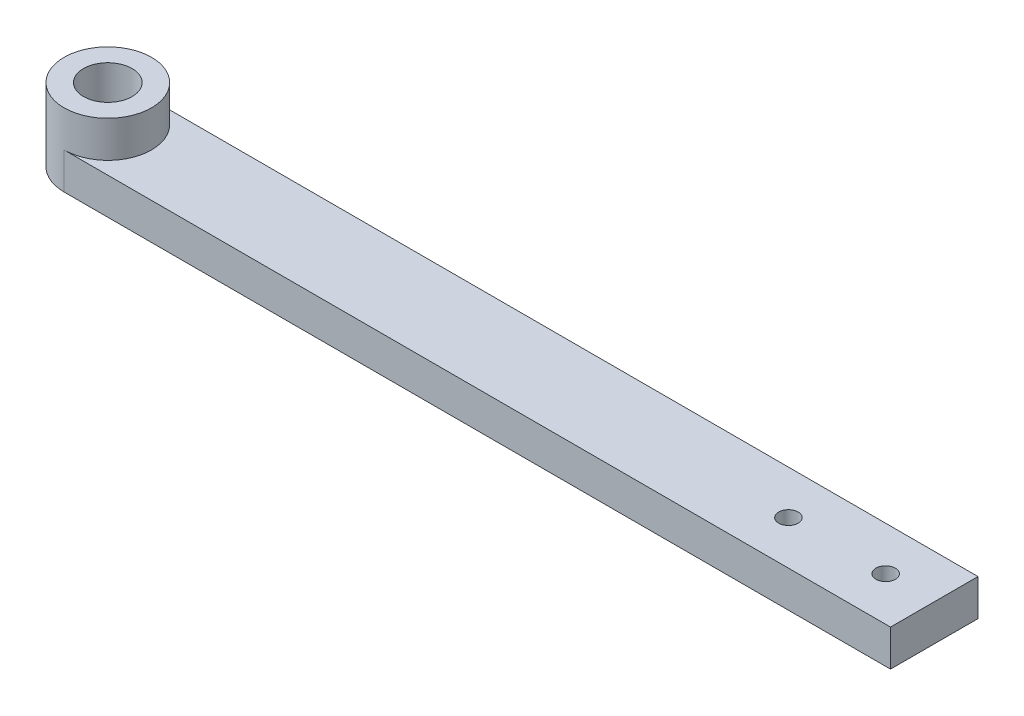
ISO-10303-21;
HEADER;
FILE_DESCRIPTION(('STEP AP214'),'2;1');
FILE_NAME('part.step','',(''),(''),'','','');
FILE_SCHEMA(('AUTOMOTIVE_DESIGN { 1 0 10303 214 1 1 1 1 }'));
ENDSEC;
DATA;
#1=APPLICATION_CONTEXT('core data for automotive mechanical design processes');
#2=APPLICATION_PROTOCOL_DEFINITION('international standard','automotive_design',2000,#1);
#3=PRODUCT_CONTEXT('',#1,'mechanical');
#4=PRODUCT('Part','Part','',(#3));
#5=PRODUCT_RELATED_PRODUCT_CATEGORY('part','',(#4));
#6=PRODUCT_DEFINITION_FORMATION('','',#4);
#7=PRODUCT_DEFINITION_CONTEXT('part definition',#1,'design');
#8=PRODUCT_DEFINITION('design','',#6,#7);
#9=PRODUCT_DEFINITION_SHAPE('','',#8);
#10=(LENGTH_UNIT() NAMED_UNIT(*) SI_UNIT(.MILLI.,.METRE.));
#11=(NAMED_UNIT(*) PLANE_ANGLE_UNIT() SI_UNIT($,.RADIAN.));
#12=(NAMED_UNIT(*) SI_UNIT($,.STERADIAN.) SOLID_ANGLE_UNIT());
#13=UNCERTAINTY_MEASURE_WITH_UNIT(LENGTH_MEASURE(1.E-05),#10,'distance_accuracy_value','');
#14=(GEOMETRIC_REPRESENTATION_CONTEXT(3) GLOBAL_UNCERTAINTY_ASSIGNED_CONTEXT((#13)) GLOBAL_UNIT_ASSIGNED_CONTEXT((#10,
#11,#12)) REPRESENTATION_CONTEXT('',''));
#15=CARTESIAN_POINT('',(0.,0.,0.));
#16=DIRECTION('',(0.,0.,1.));
#17=DIRECTION('',(1.,0.,0.));
#18=AXIS2_PLACEMENT_3D('',#15,#16,#17);
#19=CARTESIAN_POINT('',(170.,7.5,-9.));
#20=DIRECTION('',(-1.,0.,0.));
#21=DIRECTION('',(0.,0.,1.));
#22=AXIS2_PLACEMENT_3D('',#19,#20,#21);
#23=PLANE('',#22);
#24=DIRECTION('',(0.,0.,-1.));
#25=VECTOR('',#24,1.);
#26=CARTESIAN_POINT('',(170.,0.,-9.));
#27=LINE('',#26,#25);
#28=CARTESIAN_POINT('',(170.,0.,9.));
#29=VERTEX_POINT('',#28);
#30=CARTESIAN_POINT('',(170.,0.,-9.));
#31=VERTEX_POINT('',#30);
#32=EDGE_CURVE('E122',#29,#31,#27,.T.);
#33=ORIENTED_EDGE('',*,*,#32,.T.);
#34=DIRECTION('',(0.,-1.,0.));
#35=VECTOR('',#34,1.);
#36=CARTESIAN_POINT('',(170.,7.5,-9.));
#37=LINE('',#36,#35);
#38=CARTESIAN_POINT('',(170.,7.5,-9.));
#39=VERTEX_POINT('',#38);
#40=EDGE_CURVE('E11',#39,#31,#37,.T.);
#41=ORIENTED_EDGE('',*,*,#40,.F.);
#42=DIRECTION('',(0.,0.,-1.));
#43=VECTOR('',#42,1.);
#44=CARTESIAN_POINT('',(170.,7.5,-9.));
#45=LINE('',#44,#43);
#46=CARTESIAN_POINT('',(170.,7.5,9.));
#47=VERTEX_POINT('',#46);
#48=EDGE_CURVE('E138',#47,#39,#45,.T.);
#49=ORIENTED_EDGE('',*,*,#48,.F.);
#50=DIRECTION('',(0.,-1.,0.));
#51=VECTOR('',#50,1.);
#52=CARTESIAN_POINT('',(170.,7.5,9.));
#53=LINE('',#52,#51);
#54=EDGE_CURVE('E94',#47,#29,#53,.T.);
#55=ORIENTED_EDGE('',*,*,#54,.T.);
#56=EDGE_LOOP('',(#33,#41,#49,#55));
#57=FACE_BOUND('',#56,.T.);
#58=ADVANCED_FACE('F44',(#57),#23,.F.);
#59=CARTESIAN_POINT('',(0.,7.5,-9.));
#60=DIRECTION('',(0.,0.,1.));
#61=DIRECTION('',(1.,0.,0.));
#62=AXIS2_PLACEMENT_3D('',#59,#60,#61);
#63=PLANE('',#62);
#64=DIRECTION('',(-1.,0.,0.));
#65=VECTOR('',#64,1.);
#66=CARTESIAN_POINT('',(0.,0.,-9.));
#67=LINE('',#66,#65);
#68=CARTESIAN_POINT('',(0.,0.,-9.));
#69=VERTEX_POINT('',#68);
#70=EDGE_CURVE('E146',#31,#69,#67,.T.);
#71=ORIENTED_EDGE('',*,*,#70,.T.);
#72=DIRECTION('',(0.,-1.,0.));
#73=VECTOR('',#72,1.);
#74=CARTESIAN_POINT('',(0.,7.5,-9.));
#75=LINE('',#74,#73);
#76=CARTESIAN_POINT('',(0.,7.5,-9.));
#77=VERTEX_POINT('',#76);
#78=EDGE_CURVE('E53',#77,#69,#75,.T.);
#79=ORIENTED_EDGE('',*,*,#78,.F.);
#80=DIRECTION('',(-1.,0.,0.));
#81=VECTOR('',#80,1.);
#82=CARTESIAN_POINT('',(0.,7.5,-9.));
#83=LINE('',#82,#81);
#84=EDGE_CURVE('E90',#39,#77,#83,.T.);
#85=ORIENTED_EDGE('',*,*,#84,.F.);
#86=ORIENTED_EDGE('',*,*,#40,.T.);
#87=EDGE_LOOP('',(#71,#79,#85,#86));
#88=FACE_BOUND('',#87,.T.);
#89=ADVANCED_FACE('F160',(#88),#63,.F.);
#90=CARTESIAN_POINT('',(0.,7.5,0.));
#91=DIRECTION('',(0.,-1.,0.));
#92=DIRECTION('',(0.,0.,-1.));
#93=AXIS2_PLACEMENT_3D('',#90,#91,#92);
#94=CYLINDRICAL_SURFACE('',#93,9.);
#95=CARTESIAN_POINT('',(0.,0.,0.));
#96=DIRECTION('',(0.,1.,0.));
#97=DIRECTION('',(0.,0.,1.));
#98=AXIS2_PLACEMENT_3D('',#95,#96,#97);
#99=CIRCLE('',#98,9.);
#100=CARTESIAN_POINT('',(0.,0.,9.));
#101=VERTEX_POINT('',#100);
#102=EDGE_CURVE('E80',#69,#101,#99,.T.);
#103=ORIENTED_EDGE('',*,*,#102,.T.);
#104=DIRECTION('',(0.,-1.,0.));
#105=VECTOR('',#104,1.);
#106=CARTESIAN_POINT('',(0.,7.5,9.));
#107=LINE('',#106,#105);
#108=CARTESIAN_POINT('',(0.,7.5,9.));
#109=VERTEX_POINT('',#108);
#110=EDGE_CURVE('E93',#109,#101,#107,.T.);
#111=ORIENTED_EDGE('',*,*,#110,.F.);
#112=CARTESIAN_POINT('',(0.,7.5,0.));
#113=DIRECTION('',(0.,1.,0.));
#114=DIRECTION('',(0.,0.,1.));
#115=AXIS2_PLACEMENT_3D('',#112,#113,#114);
#116=CIRCLE('',#115,9.);
#117=EDGE_CURVE('E101',#109,#77,#116,.T.);
#118=ORIENTED_EDGE('',*,*,#117,.T.);
#119=ORIENTED_EDGE('',*,*,#78,.T.);
#120=EDGE_LOOP('',(#103,#111,#118,#119));
#121=FACE_BOUND('',#120,.T.);
#122=CARTESIAN_POINT('',(0.,15.,0.));
#123=DIRECTION('',(0.,1.,0.));
#124=DIRECTION('',(0.,0.,1.));
#125=AXIS2_PLACEMENT_3D('',#122,#123,#124);
#126=CIRCLE('',#125,9.);
#127=CARTESIAN_POINT('',(0.,15.,9.));
#128=VERTEX_POINT('',#127);
#129=EDGE_CURVE('E107',#128,#128,#126,.T.);
#130=ORIENTED_EDGE('',*,*,#129,.F.);
#131=EDGE_LOOP('',(#130));
#132=FACE_BOUND('',#131,.T.);
#133=ADVANCED_FACE('F99',(#121,#132),#94,.T.);
#134=CARTESIAN_POINT('',(170.,7.5,9.));
#135=DIRECTION('',(0.,0.,-1.));
#136=DIRECTION('',(-1.,0.,0.));
#137=AXIS2_PLACEMENT_3D('',#134,#135,#136);
#138=PLANE('',#137);
#139=DIRECTION('',(1.,0.,0.));
#140=VECTOR('',#139,1.);
#141=CARTESIAN_POINT('',(170.,0.,9.));
#142=LINE('',#141,#140);
#143=EDGE_CURVE('E85',#101,#29,#142,.T.);
#144=ORIENTED_EDGE('',*,*,#143,.T.);
#145=ORIENTED_EDGE('',*,*,#54,.F.);
#146=DIRECTION('',(1.,0.,0.));
#147=VECTOR('',#146,1.);
#148=CARTESIAN_POINT('',(170.,7.5,9.));
#149=LINE('',#148,#147);
#150=EDGE_CURVE('E61',#109,#47,#149,.T.);
#151=ORIENTED_EDGE('',*,*,#150,.F.);
#152=ORIENTED_EDGE('',*,*,#110,.T.);
#153=EDGE_LOOP('',(#144,#145,#151,#152));
#154=FACE_BOUND('',#153,.T.);
#155=ADVANCED_FACE('F92',(#154),#138,.F.);
#156=CARTESIAN_POINT('',(0.,7.5,0.));
#157=DIRECTION('',(0.,1.,0.));
#158=DIRECTION('',(0.,0.,1.));
#159=AXIS2_PLACEMENT_3D('',#156,#157,#158);
#160=PLANE('',#159);
#161=ORIENTED_EDGE('',*,*,#117,.F.);
#162=ORIENTED_EDGE('',*,*,#150,.T.);
#163=ORIENTED_EDGE('',*,*,#48,.T.);
#164=ORIENTED_EDGE('',*,*,#84,.T.);
#165=EDGE_LOOP('',(#161,#162,#163,#164));
#166=FACE_BOUND('',#165,.T.);
#167=CARTESIAN_POINT('',(160.,7.5,0.));
#168=DIRECTION('',(0.,1.,0.));
#169=DIRECTION('',(0.,0.,1.));
#170=AXIS2_PLACEMENT_3D('',#167,#168,#169);
#171=CIRCLE('',#170,2.);
#172=CARTESIAN_POINT('',(160.,7.5,2.));
#173=VERTEX_POINT('',#172);
#174=EDGE_CURVE('E123',#173,#173,#171,.T.);
#175=ORIENTED_EDGE('',*,*,#174,.F.);
#176=EDGE_LOOP('',(#175));
#177=FACE_BOUND('',#176,.T.);
#178=CARTESIAN_POINT('',(140.,7.5,0.));
#179=DIRECTION('',(0.,1.,0.));
#180=DIRECTION('',(0.,0.,1.));
#181=AXIS2_PLACEMENT_3D('',#178,#179,#180);
#182=CIRCLE('',#181,2.);
#183=CARTESIAN_POINT('',(140.,7.5,2.));
#184=VERTEX_POINT('',#183);
#185=EDGE_CURVE('E131',#184,#184,#182,.T.);
#186=ORIENTED_EDGE('',*,*,#185,.F.);
#187=EDGE_LOOP('',(#186));
#188=FACE_BOUND('',#187,.T.);
#189=ADVANCED_FACE('F104',(#166,#177,#188),#160,.T.);
#190=CARTESIAN_POINT('',(0.,0.,0.));
#191=DIRECTION('',(0.,1.,0.));
#192=DIRECTION('',(0.,0.,1.));
#193=AXIS2_PLACEMENT_3D('',#190,#191,#192);
#194=PLANE('',#193);
#195=CARTESIAN_POINT('',(0.,0.,0.));
#196=DIRECTION('',(0.,1.,0.));
#197=DIRECTION('',(0.,0.,1.));
#198=AXIS2_PLACEMENT_3D('',#195,#196,#197);
#199=CIRCLE('',#198,5.);
#200=CARTESIAN_POINT('',(0.,0.,5.));
#201=VERTEX_POINT('',#200);
#202=EDGE_CURVE('E118',#201,#201,#199,.T.);
#203=ORIENTED_EDGE('',*,*,#202,.T.);
#204=EDGE_LOOP('',(#203));
#205=FACE_BOUND('',#204,.T.);
#206=CARTESIAN_POINT('',(160.,0.,0.));
#207=DIRECTION('',(0.,1.,0.));
#208=DIRECTION('',(0.,0.,1.));
#209=AXIS2_PLACEMENT_3D('',#206,#207,#208);
#210=CIRCLE('',#209,2.);
#211=CARTESIAN_POINT('',(160.,0.,2.));
#212=VERTEX_POINT('',#211);
#213=EDGE_CURVE('E127',#212,#212,#210,.T.);
#214=ORIENTED_EDGE('',*,*,#213,.T.);
#215=EDGE_LOOP('',(#214));
#216=FACE_BOUND('',#215,.T.);
#217=CARTESIAN_POINT('',(140.,0.,0.));
#218=DIRECTION('',(0.,1.,0.));
#219=DIRECTION('',(0.,0.,1.));
#220=AXIS2_PLACEMENT_3D('',#217,#218,#219);
#221=CIRCLE('',#220,2.);
#222=CARTESIAN_POINT('',(140.,0.,2.));
#223=VERTEX_POINT('',#222);
#224=EDGE_CURVE('E113',#223,#223,#221,.T.);
#225=ORIENTED_EDGE('',*,*,#224,.T.);
#226=EDGE_LOOP('',(#225));
#227=FACE_BOUND('',#226,.T.);
#228=ORIENTED_EDGE('',*,*,#32,.F.);
#229=ORIENTED_EDGE('',*,*,#143,.F.);
#230=ORIENTED_EDGE('',*,*,#102,.F.);
#231=ORIENTED_EDGE('',*,*,#70,.F.);
#232=EDGE_LOOP('',(#228,#229,#230,#231));
#233=FACE_BOUND('',#232,.T.);
#234=ADVANCED_FACE('F157',(#205,#216,#227,#233),#194,.F.);
#235=CARTESIAN_POINT('',(140.,0.,0.));
#236=DIRECTION('',(0.,1.,0.));
#237=DIRECTION('',(0.,0.,1.));
#238=AXIS2_PLACEMENT_3D('',#235,#236,#237);
#239=CYLINDRICAL_SURFACE('',#238,2.);
#240=ORIENTED_EDGE('',*,*,#224,.F.);
#241=EDGE_LOOP('',(#240));
#242=FACE_BOUND('',#241,.T.);
#243=ORIENTED_EDGE('',*,*,#185,.T.);
#244=EDGE_LOOP('',(#243));
#245=FACE_BOUND('',#244,.T.);
#246=ADVANCED_FACE('F173',(#242,#245),#239,.F.);
#247=CARTESIAN_POINT('',(160.,0.,0.));
#248=DIRECTION('',(0.,1.,0.));
#249=DIRECTION('',(0.,0.,1.));
#250=AXIS2_PLACEMENT_3D('',#247,#248,#249);
#251=CYLINDRICAL_SURFACE('',#250,2.);
#252=ORIENTED_EDGE('',*,*,#213,.F.);
#253=EDGE_LOOP('',(#252));
#254=FACE_BOUND('',#253,.T.);
#255=ORIENTED_EDGE('',*,*,#174,.T.);
#256=EDGE_LOOP('',(#255));
#257=FACE_BOUND('',#256,.T.);
#258=ADVANCED_FACE('F179',(#254,#257),#251,.F.);
#259=CARTESIAN_POINT('',(0.,0.,0.));
#260=DIRECTION('',(0.,1.,0.));
#261=DIRECTION('',(0.,0.,1.));
#262=AXIS2_PLACEMENT_3D('',#259,#260,#261);
#263=CYLINDRICAL_SURFACE('',#262,5.);
#264=ORIENTED_EDGE('',*,*,#202,.F.);
#265=EDGE_LOOP('',(#264));
#266=FACE_BOUND('',#265,.T.);
#267=CARTESIAN_POINT('',(0.,15.,0.));
#268=DIRECTION('',(0.,-1.,0.));
#269=DIRECTION('',(0.,0.,-1.));
#270=AXIS2_PLACEMENT_3D('',#267,#268,#269);
#271=CIRCLE('',#270,5.);
#272=CARTESIAN_POINT('',(0.,15.,-5.));
#273=VERTEX_POINT('',#272);
#274=EDGE_CURVE('E108',#273,#273,#271,.T.);
#275=ORIENTED_EDGE('',*,*,#274,.F.);
#276=EDGE_LOOP('',(#275));
#277=FACE_BOUND('',#276,.T.);
#278=ADVANCED_FACE('F182',(#266,#277),#263,.F.);
#279=CARTESIAN_POINT('',(0.,15.,0.));
#280=DIRECTION('',(0.,1.,0.));
#281=DIRECTION('',(0.,0.,1.));
#282=AXIS2_PLACEMENT_3D('',#279,#280,#281);
#283=PLANE('',#282);
#284=ORIENTED_EDGE('',*,*,#274,.T.);
#285=EDGE_LOOP('',(#284));
#286=FACE_BOUND('',#285,.T.);
#287=ORIENTED_EDGE('',*,*,#129,.T.);
#288=EDGE_LOOP('',(#287));
#289=FACE_BOUND('',#288,.T.);
#290=ADVANCED_FACE('F186',(#286,#289),#283,.T.);
#291=CLOSED_SHELL('',(#58,#89,#133,#155,#189,#234,#246,#258,#278,#290));
#292=MANIFOLD_SOLID_BREP('B2',#291);
#293=ADVANCED_BREP_SHAPE_REPRESENTATION('',(#18,#292),#14);
#294=SHAPE_DEFINITION_REPRESENTATION(#9,#293);
ENDSEC;
END-ISO-10303-21;
